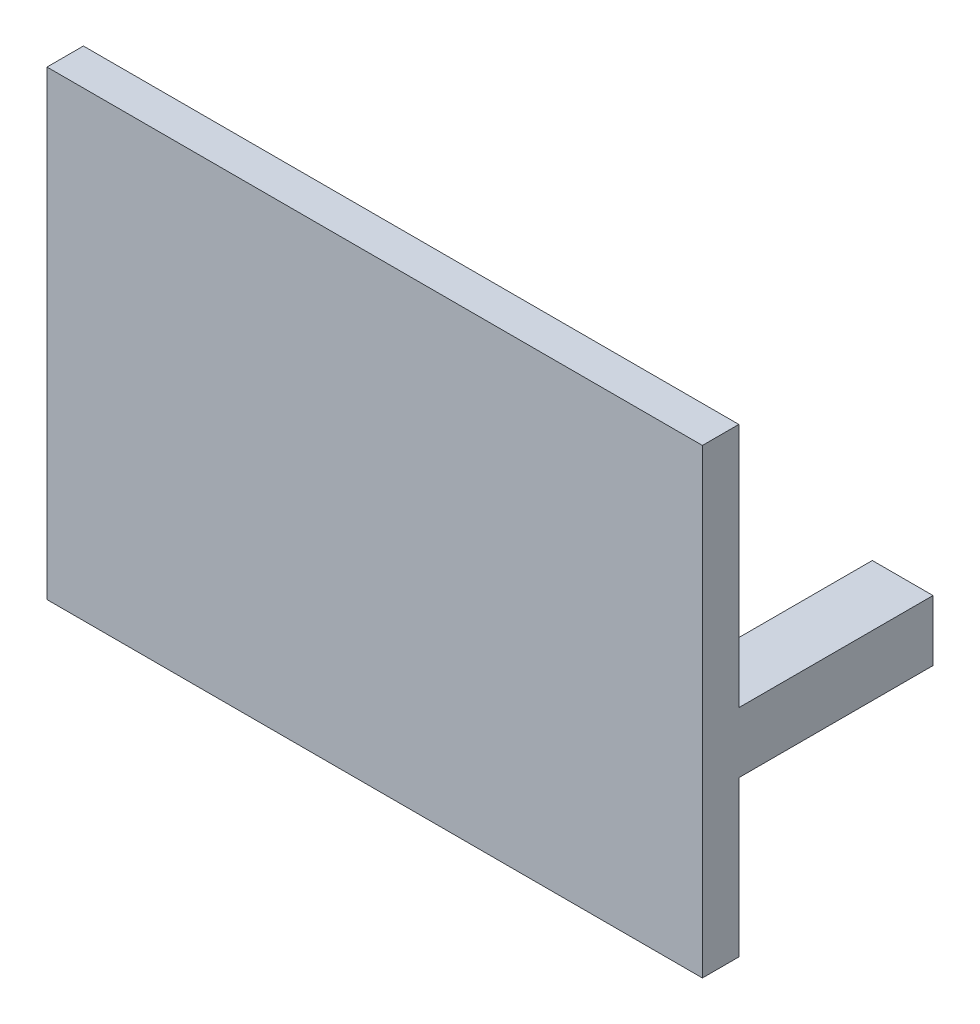
ISO-10303-21;
HEADER;
FILE_DESCRIPTION(('STEP AP214'),'2;1');
FILE_NAME('part.step','',(''),(''),'','','');
FILE_SCHEMA(('AUTOMOTIVE_DESIGN { 1 0 10303 214 1 1 1 1 }'));
ENDSEC;
DATA;
#1=APPLICATION_CONTEXT('core data for automotive mechanical design processes');
#2=APPLICATION_PROTOCOL_DEFINITION('international standard','automotive_design',2000,#1);
#3=PRODUCT_CONTEXT('',#1,'mechanical');
#4=PRODUCT('Part','Part','',(#3));
#5=PRODUCT_RELATED_PRODUCT_CATEGORY('part','',(#4));
#6=PRODUCT_DEFINITION_FORMATION('','',#4);
#7=PRODUCT_DEFINITION_CONTEXT('part definition',#1,'design');
#8=PRODUCT_DEFINITION('design','',#6,#7);
#9=PRODUCT_DEFINITION_SHAPE('','',#8);
#10=(LENGTH_UNIT() NAMED_UNIT(*) SI_UNIT(.MILLI.,.METRE.));
#11=(NAMED_UNIT(*) PLANE_ANGLE_UNIT() SI_UNIT($,.RADIAN.));
#12=(NAMED_UNIT(*) SI_UNIT($,.STERADIAN.) SOLID_ANGLE_UNIT());
#13=UNCERTAINTY_MEASURE_WITH_UNIT(LENGTH_MEASURE(1.E-05),#10,'distance_accuracy_value','');
#14=(GEOMETRIC_REPRESENTATION_CONTEXT(3) GLOBAL_UNCERTAINTY_ASSIGNED_CONTEXT((#13)) GLOBAL_UNIT_ASSIGNED_CONTEXT((#10,
#11,#12)) REPRESENTATION_CONTEXT('',''));
#15=CARTESIAN_POINT('',(0.,0.,0.));
#16=DIRECTION('',(0.,0.,1.));
#17=DIRECTION('',(1.,0.,0.));
#18=AXIS2_PLACEMENT_3D('',#15,#16,#17);
#19=CARTESIAN_POINT('',(0.,0.,3.));
#20=DIRECTION('',(1.,0.,0.));
#21=DIRECTION('',(0.,0.,-1.));
#22=AXIS2_PLACEMENT_3D('',#19,#20,#21);
#23=PLANE('',#22);
#24=DIRECTION('',(0.,-1.,0.));
#25=VECTOR('',#24,1.);
#26=CARTESIAN_POINT('',(0.,0.,0.));
#27=LINE('',#26,#25);
#28=CARTESIAN_POINT('',(0.,38.,0.));
#29=VERTEX_POINT('',#28);
#30=CARTESIAN_POINT('',(0.,0.,0.));
#31=VERTEX_POINT('',#30);
#32=EDGE_CURVE('E218',#29,#31,#27,.T.);
#33=ORIENTED_EDGE('',*,*,#32,.T.);
#34=DIRECTION('',(0.,0.,-1.));
#35=VECTOR('',#34,1.);
#36=CARTESIAN_POINT('',(0.,0.,3.));
#37=LINE('',#36,#35);
#38=CARTESIAN_POINT('',(0.,0.,3.));
#39=VERTEX_POINT('',#38);
#40=EDGE_CURVE('E11',#39,#31,#37,.T.);
#41=ORIENTED_EDGE('',*,*,#40,.F.);
#42=DIRECTION('',(0.,-1.,0.));
#43=VECTOR('',#42,1.);
#44=CARTESIAN_POINT('',(0.,0.,3.));
#45=LINE('',#44,#43);
#46=CARTESIAN_POINT('',(0.,38.,3.));
#47=VERTEX_POINT('',#46);
#48=EDGE_CURVE('E230',#47,#39,#45,.T.);
#49=ORIENTED_EDGE('',*,*,#48,.F.);
#50=DIRECTION('',(0.,0.,-1.));
#51=VECTOR('',#50,1.);
#52=CARTESIAN_POINT('',(0.,38.,3.));
#53=LINE('',#52,#51);
#54=EDGE_CURVE('E244',#47,#29,#53,.T.);
#55=ORIENTED_EDGE('',*,*,#54,.T.);
#56=EDGE_LOOP('',(#33,#41,#49,#55));
#57=FACE_BOUND('',#56,.T.);
#58=ADVANCED_FACE('F39',(#57),#23,.F.);
#59=CARTESIAN_POINT('',(0.,0.,3.));
#60=DIRECTION('',(0.,1.,0.));
#61=DIRECTION('',(0.,0.,1.));
#62=AXIS2_PLACEMENT_3D('',#59,#60,#61);
#63=PLANE('',#62);
#64=DIRECTION('',(1.,0.,0.));
#65=VECTOR('',#64,1.);
#66=CARTESIAN_POINT('',(0.,0.,0.));
#67=LINE('',#66,#65);
#68=CARTESIAN_POINT('',(54.,0.,0.));
#69=VERTEX_POINT('',#68);
#70=EDGE_CURVE('E248',#31,#69,#67,.T.);
#71=ORIENTED_EDGE('',*,*,#70,.T.);
#72=DIRECTION('',(0.,0.,-1.));
#73=VECTOR('',#72,1.);
#74=CARTESIAN_POINT('',(54.,0.,3.));
#75=LINE('',#74,#73);
#76=CARTESIAN_POINT('',(54.,0.,3.));
#77=VERTEX_POINT('',#76);
#78=EDGE_CURVE('E47',#77,#69,#75,.T.);
#79=ORIENTED_EDGE('',*,*,#78,.F.);
#80=DIRECTION('',(1.,0.,0.));
#81=VECTOR('',#80,1.);
#82=CARTESIAN_POINT('',(0.,0.,3.));
#83=LINE('',#82,#81);
#84=EDGE_CURVE('E234',#39,#77,#83,.T.);
#85=ORIENTED_EDGE('',*,*,#84,.F.);
#86=ORIENTED_EDGE('',*,*,#40,.T.);
#87=EDGE_LOOP('',(#71,#79,#85,#86));
#88=FACE_BOUND('',#87,.T.);
#89=ADVANCED_FACE('F288',(#88),#63,.F.);
#90=CARTESIAN_POINT('',(54.,0.,3.));
#91=DIRECTION('',(-1.,0.,0.));
#92=DIRECTION('',(0.,0.,1.));
#93=AXIS2_PLACEMENT_3D('',#90,#91,#92);
#94=PLANE('',#93);
#95=DIRECTION('',(0.,1.,0.));
#96=VECTOR('',#95,1.);
#97=CARTESIAN_POINT('',(54.,0.,0.));
#98=LINE('',#97,#96);
#99=CARTESIAN_POINT('',(54.,12.79,0.));
#100=VERTEX_POINT('',#99);
#101=EDGE_CURVE('E252',#69,#100,#98,.T.);
#102=ORIENTED_EDGE('',*,*,#101,.T.);
#103=DIRECTION('',(0.,0.,1.));
#104=VECTOR('',#103,1.);
#105=CARTESIAN_POINT('',(54.,12.79,-16.));
#106=LINE('',#105,#104);
#107=CARTESIAN_POINT('',(54.,12.79,-16.));
#108=VERTEX_POINT('',#107);
#109=EDGE_CURVE('E151',#108,#100,#106,.T.);
#110=ORIENTED_EDGE('',*,*,#109,.F.);
#111=DIRECTION('',(0.,1.,0.));
#112=VECTOR('',#111,1.);
#113=CARTESIAN_POINT('',(54.,17.79,-16.));
#114=LINE('',#113,#112);
#115=CARTESIAN_POINT('',(54.,17.79,-16.));
#116=VERTEX_POINT('',#115);
#117=EDGE_CURVE('E142',#108,#116,#114,.T.);
#118=ORIENTED_EDGE('',*,*,#117,.T.);
#119=DIRECTION('',(0.,0.,1.));
#120=VECTOR('',#119,1.);
#121=CARTESIAN_POINT('',(54.,17.79,-16.));
#122=LINE('',#121,#120);
#123=CARTESIAN_POINT('',(54.,17.79,0.));
#124=VERTEX_POINT('',#123);
#125=EDGE_CURVE('E127',#116,#124,#122,.T.);
#126=ORIENTED_EDGE('',*,*,#125,.T.);
#127=CARTESIAN_POINT('',(54.,38.,0.));
#128=VERTEX_POINT('',#127);
#129=EDGE_CURVE('E251',#124,#128,#98,.T.);
#130=ORIENTED_EDGE('',*,*,#129,.T.);
#131=DIRECTION('',(0.,0.,-1.));
#132=VECTOR('',#131,1.);
#133=CARTESIAN_POINT('',(54.,38.,3.));
#134=LINE('',#133,#132);
#135=CARTESIAN_POINT('',(54.,38.,3.));
#136=VERTEX_POINT('',#135);
#137=EDGE_CURVE('E260',#136,#128,#134,.T.);
#138=ORIENTED_EDGE('',*,*,#137,.F.);
#139=DIRECTION('',(0.,1.,0.));
#140=VECTOR('',#139,1.);
#141=CARTESIAN_POINT('',(54.,0.,3.));
#142=LINE('',#141,#140);
#143=EDGE_CURVE('E238',#77,#136,#142,.T.);
#144=ORIENTED_EDGE('',*,*,#143,.F.);
#145=ORIENTED_EDGE('',*,*,#78,.T.);
#146=EDGE_LOOP('',(#102,#110,#118,#126,#130,#138,#144,#145));
#147=FACE_BOUND('',#146,.T.);
#148=ADVANCED_FACE('F149',(#147),#94,.F.);
#149=CARTESIAN_POINT('',(0.,38.,3.));
#150=DIRECTION('',(0.,-1.,0.));
#151=DIRECTION('',(0.,0.,-1.));
#152=AXIS2_PLACEMENT_3D('',#149,#150,#151);
#153=PLANE('',#152);
#154=DIRECTION('',(-1.,0.,0.));
#155=VECTOR('',#154,1.);
#156=CARTESIAN_POINT('',(0.,38.,0.));
#157=LINE('',#156,#155);
#158=EDGE_CURVE('E235',#128,#29,#157,.T.);
#159=ORIENTED_EDGE('',*,*,#158,.T.);
#160=ORIENTED_EDGE('',*,*,#54,.F.);
#161=DIRECTION('',(-1.,0.,0.));
#162=VECTOR('',#161,1.);
#163=CARTESIAN_POINT('',(0.,38.,3.));
#164=LINE('',#163,#162);
#165=EDGE_CURVE('E241',#136,#47,#164,.T.);
#166=ORIENTED_EDGE('',*,*,#165,.F.);
#167=ORIENTED_EDGE('',*,*,#137,.T.);
#168=EDGE_LOOP('',(#159,#160,#166,#167));
#169=FACE_BOUND('',#168,.T.);
#170=ADVANCED_FACE('F298',(#169),#153,.F.);
#171=CARTESIAN_POINT('',(0.,0.,3.));
#172=DIRECTION('',(0.,0.,-1.));
#173=DIRECTION('',(-1.,0.,0.));
#174=AXIS2_PLACEMENT_3D('',#171,#172,#173);
#175=PLANE('',#174);
#176=ORIENTED_EDGE('',*,*,#48,.T.);
#177=ORIENTED_EDGE('',*,*,#84,.T.);
#178=ORIENTED_EDGE('',*,*,#143,.T.);
#179=ORIENTED_EDGE('',*,*,#165,.T.);
#180=EDGE_LOOP('',(#176,#177,#178,#179));
#181=FACE_BOUND('',#180,.T.);
#182=ADVANCED_FACE('F302',(#181),#175,.F.);
#183=CARTESIAN_POINT('',(0.,0.,0.));
#184=DIRECTION('',(0.,0.,-1.));
#185=DIRECTION('',(-1.,0.,0.));
#186=AXIS2_PLACEMENT_3D('',#183,#184,#185);
#187=PLANE('',#186);
#188=DIRECTION('',(1.,0.,0.));
#189=VECTOR('',#188,1.);
#190=CARTESIAN_POINT('',(49.,12.79,0.));
#191=LINE('',#190,#189);
#192=CARTESIAN_POINT('',(49.,12.79,0.));
#193=VERTEX_POINT('',#192);
#194=EDGE_CURVE('E153',#193,#100,#191,.T.);
#195=ORIENTED_EDGE('',*,*,#194,.T.);
#196=ORIENTED_EDGE('',*,*,#101,.F.);
#197=ORIENTED_EDGE('',*,*,#70,.F.);
#198=ORIENTED_EDGE('',*,*,#32,.F.);
#199=ORIENTED_EDGE('',*,*,#158,.F.);
#200=ORIENTED_EDGE('',*,*,#129,.F.);
#201=DIRECTION('',(-1.,0.,0.));
#202=VECTOR('',#201,1.);
#203=CARTESIAN_POINT('',(49.,17.79,0.));
#204=LINE('',#203,#202);
#205=CARTESIAN_POINT('',(49.,17.79,0.));
#206=VERTEX_POINT('',#205);
#207=EDGE_CURVE('E59',#124,#206,#204,.T.);
#208=ORIENTED_EDGE('',*,*,#207,.T.);
#209=DIRECTION('',(0.,-1.,0.));
#210=VECTOR('',#209,1.);
#211=CARTESIAN_POINT('',(49.,17.79,0.));
#212=LINE('',#211,#210);
#213=EDGE_CURVE('E54',#206,#193,#212,.T.);
#214=ORIENTED_EDGE('',*,*,#213,.T.);
#215=EDGE_LOOP('',(#195,#196,#197,#198,#199,#200,#208,#214));
#216=FACE_BOUND('',#215,.T.);
#217=DIRECTION('',(0.,1.,0.));
#218=VECTOR('',#217,1.);
#219=CARTESIAN_POINT('',(15.4,10.2,0.));
#220=LINE('',#219,#218);
#221=CARTESIAN_POINT('',(15.4,5.2,0.));
#222=VERTEX_POINT('',#221);
#223=CARTESIAN_POINT('',(15.4,10.2,0.));
#224=VERTEX_POINT('',#223);
#225=EDGE_CURVE('E182',#222,#224,#220,.T.);
#226=ORIENTED_EDGE('',*,*,#225,.T.);
#227=DIRECTION('',(-1.,0.,0.));
#228=VECTOR('',#227,1.);
#229=CARTESIAN_POINT('',(10.4,10.2,0.));
#230=LINE('',#229,#228);
#231=CARTESIAN_POINT('',(10.4,10.2,0.));
#232=VERTEX_POINT('',#231);
#233=EDGE_CURVE('E206',#224,#232,#230,.T.);
#234=ORIENTED_EDGE('',*,*,#233,.T.);
#235=DIRECTION('',(0.,-1.,0.));
#236=VECTOR('',#235,1.);
#237=CARTESIAN_POINT('',(10.4,10.2,0.));
#238=LINE('',#237,#236);
#239=CARTESIAN_POINT('',(10.4,5.2,0.));
#240=VERTEX_POINT('',#239);
#241=EDGE_CURVE('E209',#232,#240,#238,.T.);
#242=ORIENTED_EDGE('',*,*,#241,.T.);
#243=DIRECTION('',(1.,0.,0.));
#244=VECTOR('',#243,1.);
#245=CARTESIAN_POINT('',(10.4,5.2,0.));
#246=LINE('',#245,#244);
#247=EDGE_CURVE('E191',#240,#222,#246,.T.);
#248=ORIENTED_EDGE('',*,*,#247,.T.);
#249=EDGE_LOOP('',(#226,#234,#242,#248));
#250=FACE_BOUND('',#249,.T.);
#251=ADVANCED_FACE('F270',(#216,#250),#187,.T.);
#252=CARTESIAN_POINT('',(15.4,10.2,-16.));
#253=DIRECTION('',(1.,0.,0.));
#254=DIRECTION('',(0.,0.,-1.));
#255=AXIS2_PLACEMENT_3D('',#252,#253,#254);
#256=PLANE('',#255);
#257=ORIENTED_EDGE('',*,*,#225,.F.);
#258=DIRECTION('',(0.,0.,1.));
#259=VECTOR('',#258,1.);
#260=CARTESIAN_POINT('',(15.4,5.2,-16.));
#261=LINE('',#260,#259);
#262=CARTESIAN_POINT('',(15.4,5.2,-16.));
#263=VERTEX_POINT('',#262);
#264=EDGE_CURVE('E214',#263,#222,#261,.T.);
#265=ORIENTED_EDGE('',*,*,#264,.F.);
#266=DIRECTION('',(0.,1.,0.));
#267=VECTOR('',#266,1.);
#268=CARTESIAN_POINT('',(15.4,10.2,-16.));
#269=LINE('',#268,#267);
#270=CARTESIAN_POINT('',(15.4,10.2,-16.));
#271=VERTEX_POINT('',#270);
#272=EDGE_CURVE('E186',#263,#271,#269,.T.);
#273=ORIENTED_EDGE('',*,*,#272,.T.);
#274=DIRECTION('',(0.,0.,1.));
#275=VECTOR('',#274,1.);
#276=CARTESIAN_POINT('',(15.4,10.2,-16.));
#277=LINE('',#276,#275);
#278=EDGE_CURVE('E203',#271,#224,#277,.T.);
#279=ORIENTED_EDGE('',*,*,#278,.T.);
#280=EDGE_LOOP('',(#257,#265,#273,#279));
#281=FACE_BOUND('',#280,.T.);
#282=ADVANCED_FACE('F309',(#281),#256,.T.);
#283=CARTESIAN_POINT('',(10.4,5.2,-16.));
#284=DIRECTION('',(0.,-1.,0.));
#285=DIRECTION('',(1.,0.,0.));
#286=AXIS2_PLACEMENT_3D('',#283,#284,#285);
#287=PLANE('',#286);
#288=ORIENTED_EDGE('',*,*,#247,.F.);
#289=DIRECTION('',(0.,0.,1.));
#290=VECTOR('',#289,1.);
#291=CARTESIAN_POINT('',(10.4,5.2,-16.));
#292=LINE('',#291,#290);
#293=CARTESIAN_POINT('',(10.4,5.2,-16.));
#294=VERTEX_POINT('',#293);
#295=EDGE_CURVE('E219',#294,#240,#292,.T.);
#296=ORIENTED_EDGE('',*,*,#295,.F.);
#297=DIRECTION('',(1.,0.,0.));
#298=VECTOR('',#297,1.);
#299=CARTESIAN_POINT('',(10.4,5.2,-16.));
#300=LINE('',#299,#298);
#301=EDGE_CURVE('E199',#294,#263,#300,.T.);
#302=ORIENTED_EDGE('',*,*,#301,.T.);
#303=ORIENTED_EDGE('',*,*,#264,.T.);
#304=EDGE_LOOP('',(#288,#296,#302,#303));
#305=FACE_BOUND('',#304,.T.);
#306=ADVANCED_FACE('F370',(#305),#287,.T.);
#307=CARTESIAN_POINT('',(10.4,10.2,-16.));
#308=DIRECTION('',(-1.,0.,0.));
#309=DIRECTION('',(0.,0.,1.));
#310=AXIS2_PLACEMENT_3D('',#307,#308,#309);
#311=PLANE('',#310);
#312=ORIENTED_EDGE('',*,*,#241,.F.);
#313=DIRECTION('',(0.,0.,1.));
#314=VECTOR('',#313,1.);
#315=CARTESIAN_POINT('',(10.4,10.2,-16.));
#316=LINE('',#315,#314);
#317=CARTESIAN_POINT('',(10.4,10.2,-16.));
#318=VERTEX_POINT('',#317);
#319=EDGE_CURVE('E223',#318,#232,#316,.T.);
#320=ORIENTED_EDGE('',*,*,#319,.F.);
#321=DIRECTION('',(0.,-1.,0.));
#322=VECTOR('',#321,1.);
#323=CARTESIAN_POINT('',(10.4,10.2,-16.));
#324=LINE('',#323,#322);
#325=EDGE_CURVE('E195',#318,#294,#324,.T.);
#326=ORIENTED_EDGE('',*,*,#325,.T.);
#327=ORIENTED_EDGE('',*,*,#295,.T.);
#328=EDGE_LOOP('',(#312,#320,#326,#327));
#329=FACE_BOUND('',#328,.T.);
#330=ADVANCED_FACE('F378',(#329),#311,.T.);
#331=CARTESIAN_POINT('',(10.4,10.2,-16.));
#332=DIRECTION('',(0.,1.,0.));
#333=DIRECTION('',(0.,0.,1.));
#334=AXIS2_PLACEMENT_3D('',#331,#332,#333);
#335=PLANE('',#334);
#336=ORIENTED_EDGE('',*,*,#233,.F.);
#337=ORIENTED_EDGE('',*,*,#278,.F.);
#338=DIRECTION('',(-1.,0.,0.));
#339=VECTOR('',#338,1.);
#340=CARTESIAN_POINT('',(10.4,10.2,-16.));
#341=LINE('',#340,#339);
#342=EDGE_CURVE('E190',#271,#318,#341,.T.);
#343=ORIENTED_EDGE('',*,*,#342,.T.);
#344=ORIENTED_EDGE('',*,*,#319,.T.);
#345=EDGE_LOOP('',(#336,#337,#343,#344));
#346=FACE_BOUND('',#345,.T.);
#347=ADVANCED_FACE('F387',(#346),#335,.T.);
#348=CARTESIAN_POINT('',(0.,0.,-16.));
#349=DIRECTION('',(0.,0.,1.));
#350=DIRECTION('',(1.,0.,0.));
#351=AXIS2_PLACEMENT_3D('',#348,#349,#350);
#352=PLANE('',#351);
#353=CARTESIAN_POINT('',(12.9,7.7,-16.));
#354=DIRECTION('',(0.,0.,1.));
#355=DIRECTION('',(1.,0.,0.));
#356=AXIS2_PLACEMENT_3D('',#353,#354,#355);
#357=CIRCLE('',#356,1.6);
#358=CARTESIAN_POINT('',(14.5,7.7,-16.));
#359=VERTEX_POINT('',#358);
#360=EDGE_CURVE('E178',#359,#359,#357,.T.);
#361=ORIENTED_EDGE('',*,*,#360,.T.);
#362=EDGE_LOOP('',(#361));
#363=FACE_BOUND('',#362,.T.);
#364=ORIENTED_EDGE('',*,*,#272,.F.);
#365=ORIENTED_EDGE('',*,*,#301,.F.);
#366=ORIENTED_EDGE('',*,*,#325,.F.);
#367=ORIENTED_EDGE('',*,*,#342,.F.);
#368=EDGE_LOOP('',(#364,#365,#366,#367));
#369=FACE_BOUND('',#368,.T.);
#370=ADVANCED_FACE('F396',(#363,#369),#352,.F.);
#371=CARTESIAN_POINT('',(12.9,7.7,-16.));
#372=DIRECTION('',(0.,0.,1.));
#373=DIRECTION('',(1.,0.,0.));
#374=AXIS2_PLACEMENT_3D('',#371,#372,#373);
#375=CYLINDRICAL_SURFACE('',#374,1.6);
#376=ORIENTED_EDGE('',*,*,#360,.F.);
#377=EDGE_LOOP('',(#376));
#378=FACE_BOUND('',#377,.T.);
#379=CARTESIAN_POINT('',(12.9,7.7,0.));
#380=DIRECTION('',(0.,0.,1.));
#381=DIRECTION('',(1.,0.,0.));
#382=AXIS2_PLACEMENT_3D('',#379,#380,#381);
#383=CIRCLE('',#382,1.6);
#384=CARTESIAN_POINT('',(14.5,7.7,0.));
#385=VERTEX_POINT('',#384);
#386=EDGE_CURVE('E172',#385,#385,#383,.T.);
#387=ORIENTED_EDGE('',*,*,#386,.T.);
#388=EDGE_LOOP('',(#387));
#389=FACE_BOUND('',#388,.T.);
#390=ADVANCED_FACE('F348',(#378,#389),#375,.F.);
#391=ORIENTED_EDGE('',*,*,#386,.F.);
#392=EDGE_LOOP('',(#391));
#393=FACE_BOUND('',#392,.T.);
#394=ADVANCED_FACE('F285',(#393),#187,.T.);
#395=CARTESIAN_POINT('',(49.,12.79,-16.));
#396=DIRECTION('',(0.,-1.,0.));
#397=DIRECTION('',(0.,0.,-1.));
#398=AXIS2_PLACEMENT_3D('',#395,#396,#397);
#399=PLANE('',#398);
#400=ORIENTED_EDGE('',*,*,#194,.F.);
#401=DIRECTION('',(0.,0.,1.));
#402=VECTOR('',#401,1.);
#403=CARTESIAN_POINT('',(49.,12.79,-16.));
#404=LINE('',#403,#402);
#405=CARTESIAN_POINT('',(49.,12.79,-16.));
#406=VERTEX_POINT('',#405);
#407=EDGE_CURVE('E173',#406,#193,#404,.T.);
#408=ORIENTED_EDGE('',*,*,#407,.F.);
#409=DIRECTION('',(1.,0.,0.));
#410=VECTOR('',#409,1.);
#411=CARTESIAN_POINT('',(49.,12.79,-16.));
#412=LINE('',#411,#410);
#413=EDGE_CURVE('E135',#406,#108,#412,.T.);
#414=ORIENTED_EDGE('',*,*,#413,.T.);
#415=ORIENTED_EDGE('',*,*,#109,.T.);
#416=EDGE_LOOP('',(#400,#408,#414,#415));
#417=FACE_BOUND('',#416,.T.);
#418=ADVANCED_FACE('F275',(#417),#399,.T.);
#419=CARTESIAN_POINT('',(49.,17.79,-16.));
#420=DIRECTION('',(-1.,0.,0.));
#421=DIRECTION('',(0.,0.,1.));
#422=AXIS2_PLACEMENT_3D('',#419,#420,#421);
#423=PLANE('',#422);
#424=ORIENTED_EDGE('',*,*,#213,.F.);
#425=DIRECTION('',(0.,0.,1.));
#426=VECTOR('',#425,1.);
#427=CARTESIAN_POINT('',(49.,17.79,-16.));
#428=LINE('',#427,#426);
#429=CARTESIAN_POINT('',(49.,17.79,-16.));
#430=VERTEX_POINT('',#429);
#431=EDGE_CURVE('E134',#430,#206,#428,.T.);
#432=ORIENTED_EDGE('',*,*,#431,.F.);
#433=DIRECTION('',(0.,-1.,0.));
#434=VECTOR('',#433,1.);
#435=CARTESIAN_POINT('',(49.,17.79,-16.));
#436=LINE('',#435,#434);
#437=EDGE_CURVE('E145',#430,#406,#436,.T.);
#438=ORIENTED_EDGE('',*,*,#437,.T.);
#439=ORIENTED_EDGE('',*,*,#407,.T.);
#440=EDGE_LOOP('',(#424,#432,#438,#439));
#441=FACE_BOUND('',#440,.T.);
#442=ADVANCED_FACE('F277',(#441),#423,.T.);
#443=CARTESIAN_POINT('',(49.,17.79,-16.));
#444=DIRECTION('',(0.,1.,0.));
#445=DIRECTION('',(0.,0.,1.));
#446=AXIS2_PLACEMENT_3D('',#443,#444,#445);
#447=PLANE('',#446);
#448=ORIENTED_EDGE('',*,*,#207,.F.);
#449=ORIENTED_EDGE('',*,*,#125,.F.);
#450=DIRECTION('',(-1.,0.,0.));
#451=VECTOR('',#450,1.);
#452=CARTESIAN_POINT('',(49.,17.79,-16.));
#453=LINE('',#452,#451);
#454=EDGE_CURVE('E130',#116,#430,#453,.T.);
#455=ORIENTED_EDGE('',*,*,#454,.T.);
#456=ORIENTED_EDGE('',*,*,#431,.T.);
#457=EDGE_LOOP('',(#448,#449,#455,#456));
#458=FACE_BOUND('',#457,.T.);
#459=ADVANCED_FACE('F129',(#458),#447,.T.);
#460=CARTESIAN_POINT('',(0.,0.,-16.));
#461=DIRECTION('',(0.,0.,1.));
#462=DIRECTION('',(1.,0.,0.));
#463=AXIS2_PLACEMENT_3D('',#460,#461,#462);
#464=PLANE('',#463);
#465=CARTESIAN_POINT('',(51.5,15.29,-16.));
#466=DIRECTION('',(0.,0.,1.));
#467=DIRECTION('',(1.,0.,0.));
#468=AXIS2_PLACEMENT_3D('',#465,#466,#467);
#469=CIRCLE('',#468,1.6);
#470=CARTESIAN_POINT('',(53.1,15.29,-16.));
#471=VERTEX_POINT('',#470);
#472=EDGE_CURVE('E167',#471,#471,#469,.T.);
#473=ORIENTED_EDGE('',*,*,#472,.T.);
#474=EDGE_LOOP('',(#473));
#475=FACE_BOUND('',#474,.T.);
#476=ORIENTED_EDGE('',*,*,#117,.F.);
#477=ORIENTED_EDGE('',*,*,#413,.F.);
#478=ORIENTED_EDGE('',*,*,#437,.F.);
#479=ORIENTED_EDGE('',*,*,#454,.F.);
#480=EDGE_LOOP('',(#476,#477,#478,#479));
#481=FACE_BOUND('',#480,.T.);
#482=ADVANCED_FACE('F140',(#475,#481),#464,.F.);
#483=CARTESIAN_POINT('',(51.5,15.29,-16.));
#484=DIRECTION('',(0.,0.,1.));
#485=DIRECTION('',(1.,0.,0.));
#486=AXIS2_PLACEMENT_3D('',#483,#484,#485);
#487=CYLINDRICAL_SURFACE('',#486,1.6);
#488=ORIENTED_EDGE('',*,*,#472,.F.);
#489=EDGE_LOOP('',(#488));
#490=FACE_BOUND('',#489,.T.);
#491=CARTESIAN_POINT('',(51.5,15.29,0.));
#492=DIRECTION('',(0.,0.,1.));
#493=DIRECTION('',(1.,0.,0.));
#494=AXIS2_PLACEMENT_3D('',#491,#492,#493);
#495=CIRCLE('',#494,1.6);
#496=CARTESIAN_POINT('',(53.1,15.29,0.));
#497=VERTEX_POINT('',#496);
#498=EDGE_CURVE('E158',#497,#497,#495,.T.);
#499=ORIENTED_EDGE('',*,*,#498,.T.);
#500=EDGE_LOOP('',(#499));
#501=FACE_BOUND('',#500,.T.);
#502=ADVANCED_FACE('F357',(#490,#501),#487,.F.);
#503=ORIENTED_EDGE('',*,*,#498,.F.);
#504=EDGE_LOOP('',(#503));
#505=FACE_BOUND('',#504,.T.);
#506=ADVANCED_FACE('F311',(#505),#187,.T.);
#507=CLOSED_SHELL('',(#58,#89,#148,#170,#182,#251,#282,#306,#330,#347,#370,#390,#394,#418,#442,
#459,#482,#502,#506));
#508=MANIFOLD_SOLID_BREP('B2',#507);
#509=ADVANCED_BREP_SHAPE_REPRESENTATION('',(#18,#508),#14);
#510=SHAPE_DEFINITION_REPRESENTATION(#9,#509);
ENDSEC;
END-ISO-10303-21;
